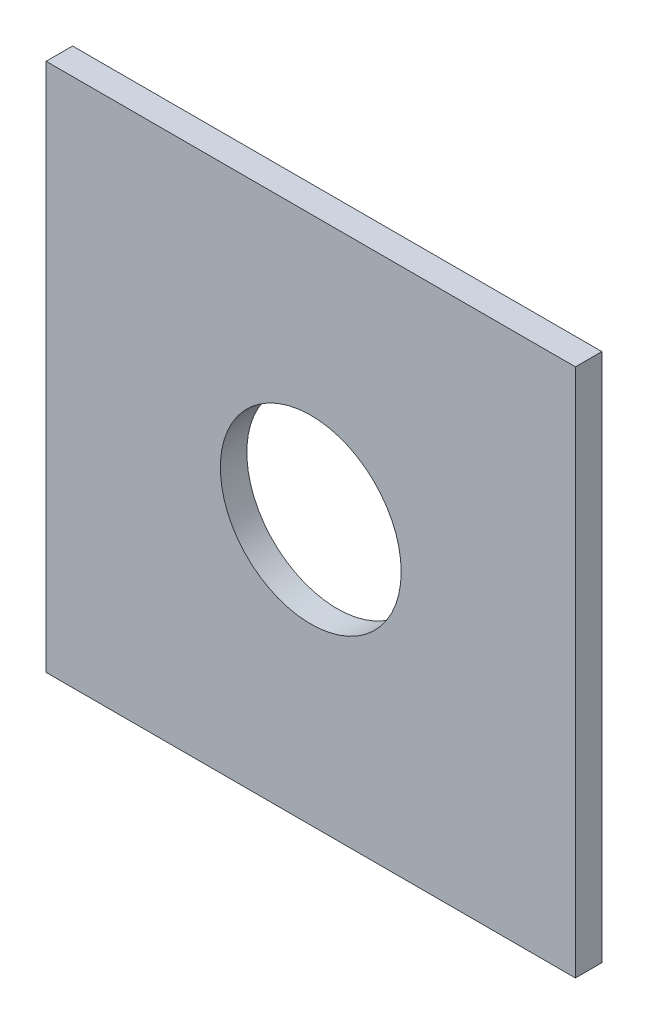
ISO-10303-21;
HEADER;
FILE_DESCRIPTION(('STEP AP214'),'2;1');
FILE_NAME('part.step','',(''),(''),'','','');
FILE_SCHEMA(('AUTOMOTIVE_DESIGN { 1 0 10303 214 1 1 1 1 }'));
ENDSEC;
DATA;
#1=APPLICATION_CONTEXT('core data for automotive mechanical design processes');
#2=APPLICATION_PROTOCOL_DEFINITION('international standard','automotive_design',2000,#1);
#3=PRODUCT_CONTEXT('',#1,'mechanical');
#4=PRODUCT('Part','Part','',(#3));
#5=PRODUCT_RELATED_PRODUCT_CATEGORY('part','',(#4));
#6=PRODUCT_DEFINITION_FORMATION('','',#4);
#7=PRODUCT_DEFINITION_CONTEXT('part definition',#1,'design');
#8=PRODUCT_DEFINITION('design','',#6,#7);
#9=PRODUCT_DEFINITION_SHAPE('','',#8);
#10=(LENGTH_UNIT() NAMED_UNIT(*) SI_UNIT(.MILLI.,.METRE.));
#11=(NAMED_UNIT(*) PLANE_ANGLE_UNIT() SI_UNIT($,.RADIAN.));
#12=(NAMED_UNIT(*) SI_UNIT($,.STERADIAN.) SOLID_ANGLE_UNIT());
#13=UNCERTAINTY_MEASURE_WITH_UNIT(LENGTH_MEASURE(1.E-05),#10,'distance_accuracy_value','');
#14=(GEOMETRIC_REPRESENTATION_CONTEXT(3) GLOBAL_UNCERTAINTY_ASSIGNED_CONTEXT((#13)) GLOBAL_UNIT_ASSIGNED_CONTEXT((#10,
#11,#12)) REPRESENTATION_CONTEXT('',''));
#15=CARTESIAN_POINT('',(0.,0.,0.));
#16=DIRECTION('',(0.,0.,1.));
#17=DIRECTION('',(1.,0.,0.));
#18=AXIS2_PLACEMENT_3D('',#15,#16,#17);
#19=CARTESIAN_POINT('',(30.,-30.,3.));
#20=DIRECTION('',(-1.,0.,0.));
#21=DIRECTION('',(0.,0.,1.));
#22=AXIS2_PLACEMENT_3D('',#19,#20,#21);
#23=PLANE('',#22);
#24=DIRECTION('',(0.,1.,0.));
#25=VECTOR('',#24,1.);
#26=CARTESIAN_POINT('',(30.,-30.,0.));
#27=LINE('',#26,#25);
#28=CARTESIAN_POINT('',(30.,-30.,0.));
#29=VERTEX_POINT('',#28);
#30=CARTESIAN_POINT('',(30.,30.,0.));
#31=VERTEX_POINT('',#30);
#32=EDGE_CURVE('E105',#29,#31,#27,.T.);
#33=ORIENTED_EDGE('',*,*,#32,.T.);
#34=DIRECTION('',(0.,0.,-1.));
#35=VECTOR('',#34,1.);
#36=CARTESIAN_POINT('',(30.,30.,3.));
#37=LINE('',#36,#35);
#38=CARTESIAN_POINT('',(30.,30.,3.));
#39=VERTEX_POINT('',#38);
#40=EDGE_CURVE('E11',#39,#31,#37,.T.);
#41=ORIENTED_EDGE('',*,*,#40,.F.);
#42=DIRECTION('',(0.,1.,0.));
#43=VECTOR('',#42,1.);
#44=CARTESIAN_POINT('',(30.,-30.,3.));
#45=LINE('',#44,#43);
#46=CARTESIAN_POINT('',(30.,-30.,3.));
#47=VERTEX_POINT('',#46);
#48=EDGE_CURVE('E89',#47,#39,#45,.T.);
#49=ORIENTED_EDGE('',*,*,#48,.F.);
#50=DIRECTION('',(0.,0.,-1.));
#51=VECTOR('',#50,1.);
#52=CARTESIAN_POINT('',(30.,-30.,3.));
#53=LINE('',#52,#51);
#54=EDGE_CURVE('E98',#47,#29,#53,.T.);
#55=ORIENTED_EDGE('',*,*,#54,.T.);
#56=EDGE_LOOP('',(#33,#41,#49,#55));
#57=FACE_BOUND('',#56,.T.);
#58=ADVANCED_FACE('F39',(#57),#23,.F.);
#59=CARTESIAN_POINT('',(-30.,30.,3.));
#60=DIRECTION('',(0.,-1.,0.));
#61=DIRECTION('',(0.,0.,-1.));
#62=AXIS2_PLACEMENT_3D('',#59,#60,#61);
#63=PLANE('',#62);
#64=DIRECTION('',(-1.,0.,0.));
#65=VECTOR('',#64,1.);
#66=CARTESIAN_POINT('',(-30.,30.,0.));
#67=LINE('',#66,#65);
#68=CARTESIAN_POINT('',(-30.,30.,0.));
#69=VERTEX_POINT('',#68);
#70=EDGE_CURVE('E94',#31,#69,#67,.T.);
#71=ORIENTED_EDGE('',*,*,#70,.T.);
#72=DIRECTION('',(0.,0.,-1.));
#73=VECTOR('',#72,1.);
#74=CARTESIAN_POINT('',(-30.,30.,3.));
#75=LINE('',#74,#73);
#76=CARTESIAN_POINT('',(-30.,30.,3.));
#77=VERTEX_POINT('',#76);
#78=EDGE_CURVE('E50',#77,#69,#75,.T.);
#79=ORIENTED_EDGE('',*,*,#78,.F.);
#80=DIRECTION('',(-1.,0.,0.));
#81=VECTOR('',#80,1.);
#82=CARTESIAN_POINT('',(-30.,30.,3.));
#83=LINE('',#82,#81);
#84=EDGE_CURVE('E84',#39,#77,#83,.T.);
#85=ORIENTED_EDGE('',*,*,#84,.F.);
#86=ORIENTED_EDGE('',*,*,#40,.T.);
#87=EDGE_LOOP('',(#71,#79,#85,#86));
#88=FACE_BOUND('',#87,.T.);
#89=ADVANCED_FACE('F91',(#88),#63,.F.);
#90=CARTESIAN_POINT('',(-30.,-30.,3.));
#91=DIRECTION('',(1.,0.,0.));
#92=DIRECTION('',(0.,0.,-1.));
#93=AXIS2_PLACEMENT_3D('',#90,#91,#92);
#94=PLANE('',#93);
#95=DIRECTION('',(0.,-1.,0.));
#96=VECTOR('',#95,1.);
#97=CARTESIAN_POINT('',(-30.,-30.,0.));
#98=LINE('',#97,#96);
#99=CARTESIAN_POINT('',(-30.,-30.,0.));
#100=VERTEX_POINT('',#99);
#101=EDGE_CURVE('E75',#69,#100,#98,.T.);
#102=ORIENTED_EDGE('',*,*,#101,.T.);
#103=DIRECTION('',(0.,0.,-1.));
#104=VECTOR('',#103,1.);
#105=CARTESIAN_POINT('',(-30.,-30.,3.));
#106=LINE('',#105,#104);
#107=CARTESIAN_POINT('',(-30.,-30.,3.));
#108=VERTEX_POINT('',#107);
#109=EDGE_CURVE('E92',#108,#100,#106,.T.);
#110=ORIENTED_EDGE('',*,*,#109,.F.);
#111=DIRECTION('',(0.,-1.,0.));
#112=VECTOR('',#111,1.);
#113=CARTESIAN_POINT('',(-30.,-30.,3.));
#114=LINE('',#113,#112);
#115=EDGE_CURVE('E86',#77,#108,#114,.T.);
#116=ORIENTED_EDGE('',*,*,#115,.F.);
#117=ORIENTED_EDGE('',*,*,#78,.T.);
#118=EDGE_LOOP('',(#102,#110,#116,#117));
#119=FACE_BOUND('',#118,.T.);
#120=ADVANCED_FACE('F96',(#119),#94,.F.);
#121=CARTESIAN_POINT('',(-30.,-30.,3.));
#122=DIRECTION('',(0.,1.,0.));
#123=DIRECTION('',(0.,0.,1.));
#124=AXIS2_PLACEMENT_3D('',#121,#122,#123);
#125=PLANE('',#124);
#126=DIRECTION('',(1.,0.,0.));
#127=VECTOR('',#126,1.);
#128=CARTESIAN_POINT('',(-30.,-30.,0.));
#129=LINE('',#128,#127);
#130=EDGE_CURVE('E77',#100,#29,#129,.T.);
#131=ORIENTED_EDGE('',*,*,#130,.T.);
#132=ORIENTED_EDGE('',*,*,#54,.F.);
#133=DIRECTION('',(1.,0.,0.));
#134=VECTOR('',#133,1.);
#135=CARTESIAN_POINT('',(-30.,-30.,3.));
#136=LINE('',#135,#134);
#137=EDGE_CURVE('E54',#108,#47,#136,.T.);
#138=ORIENTED_EDGE('',*,*,#137,.F.);
#139=ORIENTED_EDGE('',*,*,#109,.T.);
#140=EDGE_LOOP('',(#131,#132,#138,#139));
#141=FACE_BOUND('',#140,.T.);
#142=ADVANCED_FACE('F109',(#141),#125,.F.);
#143=CARTESIAN_POINT('',(0.,0.,3.));
#144=DIRECTION('',(0.,0.,-1.));
#145=DIRECTION('',(-1.,0.,0.));
#146=AXIS2_PLACEMENT_3D('',#143,#144,#145);
#147=PLANE('',#146);
#148=CARTESIAN_POINT('',(0.,0.,3.));
#149=DIRECTION('',(0.,0.,1.));
#150=DIRECTION('',(1.,0.,0.));
#151=AXIS2_PLACEMENT_3D('',#148,#149,#150);
#152=CIRCLE('',#151,10.25);
#153=CARTESIAN_POINT('',(10.25,0.,3.));
#154=VERTEX_POINT('',#153);
#155=EDGE_CURVE('E118',#154,#154,#152,.T.);
#156=ORIENTED_EDGE('',*,*,#155,.F.);
#157=EDGE_LOOP('',(#156));
#158=FACE_BOUND('',#157,.T.);
#159=ORIENTED_EDGE('',*,*,#48,.T.);
#160=ORIENTED_EDGE('',*,*,#84,.T.);
#161=ORIENTED_EDGE('',*,*,#115,.T.);
#162=ORIENTED_EDGE('',*,*,#137,.T.);
#163=EDGE_LOOP('',(#159,#160,#161,#162));
#164=FACE_BOUND('',#163,.T.);
#165=ADVANCED_FACE('F88',(#158,#164),#147,.F.);
#166=CARTESIAN_POINT('',(0.,0.,0.));
#167=DIRECTION('',(0.,0.,-1.));
#168=DIRECTION('',(-1.,0.,0.));
#169=AXIS2_PLACEMENT_3D('',#166,#167,#168);
#170=PLANE('',#169);
#171=CARTESIAN_POINT('',(0.,0.,0.));
#172=DIRECTION('',(0.,0.,1.));
#173=DIRECTION('',(1.,0.,0.));
#174=AXIS2_PLACEMENT_3D('',#171,#172,#173);
#175=CIRCLE('',#174,10.25);
#176=CARTESIAN_POINT('',(10.25,0.,0.));
#177=VERTEX_POINT('',#176);
#178=EDGE_CURVE('E104',#177,#177,#175,.T.);
#179=ORIENTED_EDGE('',*,*,#178,.T.);
#180=EDGE_LOOP('',(#179));
#181=FACE_BOUND('',#180,.T.);
#182=ORIENTED_EDGE('',*,*,#32,.F.);
#183=ORIENTED_EDGE('',*,*,#130,.F.);
#184=ORIENTED_EDGE('',*,*,#101,.F.);
#185=ORIENTED_EDGE('',*,*,#70,.F.);
#186=EDGE_LOOP('',(#182,#183,#184,#185));
#187=FACE_BOUND('',#186,.T.);
#188=ADVANCED_FACE('F114',(#181,#187),#170,.T.);
#189=CARTESIAN_POINT('',(0.,0.,0.));
#190=DIRECTION('',(0.,0.,1.));
#191=DIRECTION('',(1.,0.,0.));
#192=AXIS2_PLACEMENT_3D('',#189,#190,#191);
#193=CYLINDRICAL_SURFACE('',#192,10.25);
#194=ORIENTED_EDGE('',*,*,#178,.F.);
#195=EDGE_LOOP('',(#194));
#196=FACE_BOUND('',#195,.T.);
#197=ORIENTED_EDGE('',*,*,#155,.T.);
#198=EDGE_LOOP('',(#197));
#199=FACE_BOUND('',#198,.T.);
#200=ADVANCED_FACE('F121',(#196,#199),#193,.F.);
#201=CLOSED_SHELL('',(#58,#89,#120,#142,#165,#188,#200));
#202=MANIFOLD_SOLID_BREP('B2',#201);
#203=ADVANCED_BREP_SHAPE_REPRESENTATION('',(#18,#202),#14);
#204=SHAPE_DEFINITION_REPRESENTATION(#9,#203);
ENDSEC;
END-ISO-10303-21;
